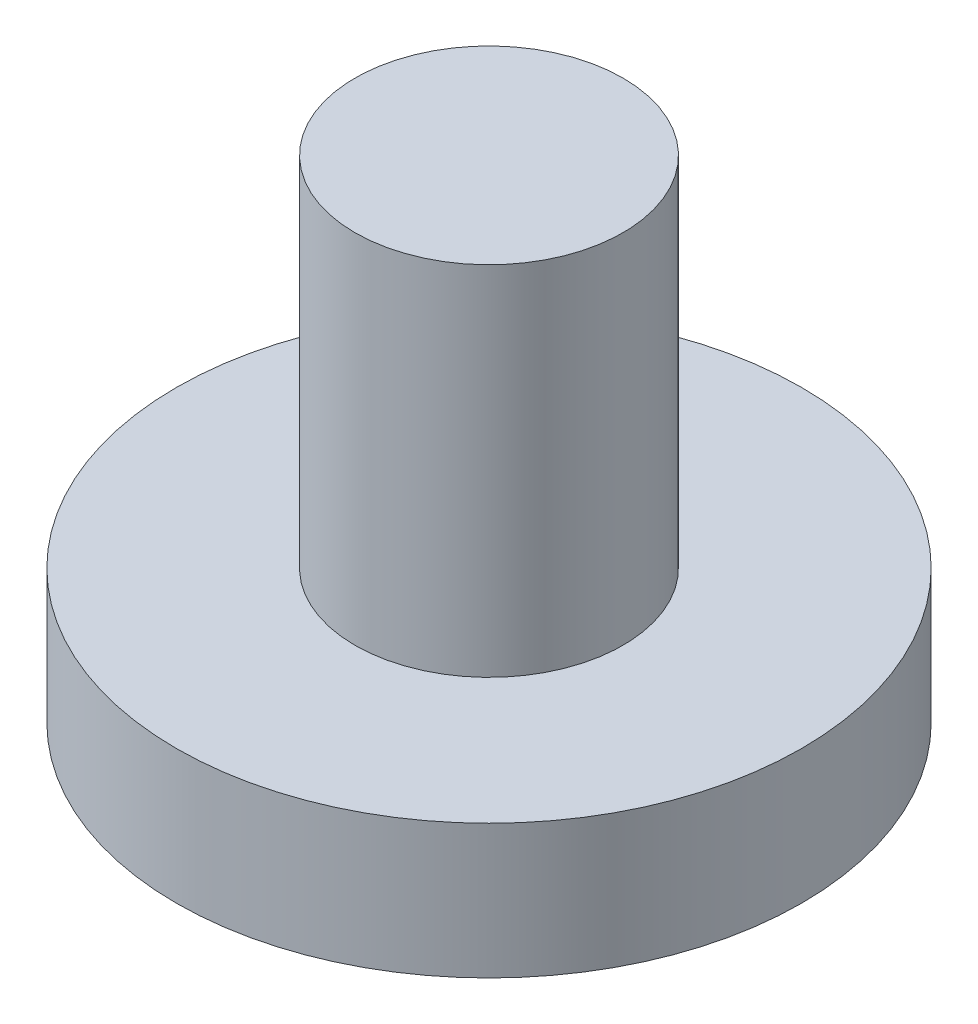
ISO-10303-21;
HEADER;
FILE_DESCRIPTION(('STEP AP214'),'2;1');
FILE_NAME('part.step','',(''),(''),'','','');
FILE_SCHEMA(('AUTOMOTIVE_DESIGN { 1 0 10303 214 1 1 1 1 }'));
ENDSEC;
DATA;
#1=APPLICATION_CONTEXT('core data for automotive mechanical design processes');
#2=APPLICATION_PROTOCOL_DEFINITION('international standard','automotive_design',2000,#1);
#3=PRODUCT_CONTEXT('',#1,'mechanical');
#4=PRODUCT('Part','Part','',(#3));
#5=PRODUCT_RELATED_PRODUCT_CATEGORY('part','',(#4));
#6=PRODUCT_DEFINITION_FORMATION('','',#4);
#7=PRODUCT_DEFINITION_CONTEXT('part definition',#1,'design');
#8=PRODUCT_DEFINITION('design','',#6,#7);
#9=PRODUCT_DEFINITION_SHAPE('','',#8);
#10=(LENGTH_UNIT() NAMED_UNIT(*) SI_UNIT(.MILLI.,.METRE.));
#11=(NAMED_UNIT(*) PLANE_ANGLE_UNIT() SI_UNIT($,.RADIAN.));
#12=(NAMED_UNIT(*) SI_UNIT($,.STERADIAN.) SOLID_ANGLE_UNIT());
#13=UNCERTAINTY_MEASURE_WITH_UNIT(LENGTH_MEASURE(1.E-05),#10,'distance_accuracy_value','');
#14=(GEOMETRIC_REPRESENTATION_CONTEXT(3) GLOBAL_UNCERTAINTY_ASSIGNED_CONTEXT((#13)) GLOBAL_UNIT_ASSIGNED_CONTEXT((#10,
#11,#12)) REPRESENTATION_CONTEXT('',''));
#15=CARTESIAN_POINT('',(0.,0.,0.));
#16=DIRECTION('',(0.,0.,1.));
#17=DIRECTION('',(1.,0.,0.));
#18=AXIS2_PLACEMENT_3D('',#15,#16,#17);
#19=CARTESIAN_POINT('',(0.,5.5,0.));
#20=DIRECTION('',(0.,1.,0.));
#21=DIRECTION('',(0.,0.,1.));
#22=AXIS2_PLACEMENT_3D('',#19,#20,#21);
#23=PLANE('',#22);
#24=CARTESIAN_POINT('',(0.,5.5,0.));
#25=DIRECTION('',(0.,-1.,0.));
#26=DIRECTION('',(0.,0.,-1.));
#27=AXIS2_PLACEMENT_3D('',#24,#25,#26);
#28=CIRCLE('',#27,1.5);
#29=CARTESIAN_POINT('',(0.,5.5,-1.5));
#30=VERTEX_POINT('',#29);
#31=EDGE_CURVE('E19',#30,#30,#28,.T.);
#32=ORIENTED_EDGE('',*,*,#31,.F.);
#33=EDGE_LOOP('',(#32));
#34=FACE_BOUND('',#33,.T.);
#35=ADVANCED_FACE('F16',(#34),#23,.T.);
#36=CARTESIAN_POINT('',(0.,5.5,0.));
#37=DIRECTION('',(0.,-1.,0.));
#38=DIRECTION('',(0.,0.,-1.));
#39=AXIS2_PLACEMENT_3D('',#36,#37,#38);
#40=CYLINDRICAL_SURFACE('',#39,1.5);
#41=CARTESIAN_POINT('',(0.,1.5,0.));
#42=DIRECTION('',(0.,-1.,0.));
#43=DIRECTION('',(0.,0.,-1.));
#44=AXIS2_PLACEMENT_3D('',#41,#42,#43);
#45=CIRCLE('',#44,1.5);
#46=CARTESIAN_POINT('',(0.,1.5,-1.5));
#47=VERTEX_POINT('',#46);
#48=EDGE_CURVE('E78',#47,#47,#45,.T.);
#49=ORIENTED_EDGE('',*,*,#48,.F.);
#50=EDGE_LOOP('',(#49));
#51=FACE_BOUND('',#50,.T.);
#52=ORIENTED_EDGE('',*,*,#31,.T.);
#53=EDGE_LOOP('',(#52));
#54=FACE_BOUND('',#53,.T.);
#55=ADVANCED_FACE('F102',(#51,#54),#40,.T.);
#56=CARTESIAN_POINT('',(0.,0.8,0.));
#57=DIRECTION('',(0.,-1.,0.));
#58=DIRECTION('',(0.,0.,-1.));
#59=AXIS2_PLACEMENT_3D('',#56,#57,#58);
#60=PLANE('',#59);
#61=DIRECTION('',(-0.5,0.,0.866025403784439));
#62=VECTOR('',#61,1.);
#63=CARTESIAN_POINT('',(-1.15470053837925,0.8,0.));
#64=LINE('',#63,#62);
#65=CARTESIAN_POINT('',(-1.15470053837925,0.8,0.));
#66=VERTEX_POINT('',#65);
#67=CARTESIAN_POINT('',(-0.577350269189625,0.8,-1.));
#68=VERTEX_POINT('',#67);
#69=EDGE_CURVE('E232',#66,#68,#64,.F.);
#70=ORIENTED_EDGE('',*,*,#69,.T.);
#71=DIRECTION('',(-1.,0.,0.));
#72=VECTOR('',#71,1.);
#73=CARTESIAN_POINT('',(-0.577350269189625,0.8,-1.));
#74=LINE('',#73,#72);
#75=CARTESIAN_POINT('',(0.577350269189626,0.8,-1.));
#76=VERTEX_POINT('',#75);
#77=EDGE_CURVE('E238',#68,#76,#74,.F.);
#78=ORIENTED_EDGE('',*,*,#77,.T.);
#79=DIRECTION('',(-0.5,0.,-0.866025403784439));
#80=VECTOR('',#79,1.);
#81=CARTESIAN_POINT('',(0.577350269189626,0.8,-1.));
#82=LINE('',#81,#80);
#83=CARTESIAN_POINT('',(1.15470053837925,0.8,0.));
#84=VERTEX_POINT('',#83);
#85=EDGE_CURVE('E246',#76,#84,#82,.F.);
#86=ORIENTED_EDGE('',*,*,#85,.T.);
#87=DIRECTION('',(0.5,0.,-0.866025403784439));
#88=VECTOR('',#87,1.);
#89=CARTESIAN_POINT('',(1.15470053837925,0.8,0.));
#90=LINE('',#89,#88);
#91=CARTESIAN_POINT('',(0.577350269189625,0.8,1.));
#92=VERTEX_POINT('',#91);
#93=EDGE_CURVE('E72',#84,#92,#90,.F.);
#94=ORIENTED_EDGE('',*,*,#93,.T.);
#95=DIRECTION('',(1.,0.,0.));
#96=VECTOR('',#95,1.);
#97=CARTESIAN_POINT('',(0.577350269189625,0.8,1.));
#98=LINE('',#97,#96);
#99=CARTESIAN_POINT('',(-0.577350269189626,0.8,1.));
#100=VERTEX_POINT('',#99);
#101=EDGE_CURVE('E70',#92,#100,#98,.F.);
#102=ORIENTED_EDGE('',*,*,#101,.T.);
#103=DIRECTION('',(0.5,0.,0.866025403784439));
#104=VECTOR('',#103,1.);
#105=CARTESIAN_POINT('',(-0.577350269189626,0.8,1.));
#106=LINE('',#105,#104);
#107=EDGE_CURVE('E67',#100,#66,#106,.F.);
#108=ORIENTED_EDGE('',*,*,#107,.T.);
#109=EDGE_LOOP('',(#70,#78,#86,#94,#102,#108));
#110=FACE_BOUND('',#109,.T.);
#111=ADVANCED_FACE('F71',(#110),#60,.T.);
#112=CARTESIAN_POINT('',(0.,1.5,0.));
#113=DIRECTION('',(0.,1.,0.));
#114=DIRECTION('',(0.,0.,1.));
#115=AXIS2_PLACEMENT_3D('',#112,#113,#114);
#116=PLANE('',#115);
#117=ORIENTED_EDGE('',*,*,#48,.T.);
#118=EDGE_LOOP('',(#117));
#119=FACE_BOUND('',#118,.T.);
#120=CARTESIAN_POINT('',(0.,1.5,0.));
#121=DIRECTION('',(0.,-1.,0.));
#122=DIRECTION('',(0.,0.,-1.));
#123=AXIS2_PLACEMENT_3D('',#120,#121,#122);
#124=CIRCLE('',#123,3.5);
#125=CARTESIAN_POINT('',(0.,1.5,-3.5));
#126=VERTEX_POINT('',#125);
#127=EDGE_CURVE('E93',#126,#126,#124,.T.);
#128=ORIENTED_EDGE('',*,*,#127,.F.);
#129=EDGE_LOOP('',(#128));
#130=FACE_BOUND('',#129,.T.);
#131=ADVANCED_FACE('F142',(#119,#130),#116,.T.);
#132=CARTESIAN_POINT('',(0.577350269189625,0.8,1.));
#133=DIRECTION('',(0.,0.,1.));
#134=DIRECTION('',(1.,0.,0.));
#135=AXIS2_PLACEMENT_3D('',#132,#133,#134);
#136=PLANE('',#135);
#137=DIRECTION('',(0.,1.,0.));
#138=VECTOR('',#137,1.);
#139=CARTESIAN_POINT('',(-0.577350269189626,0.8,1.));
#140=LINE('',#139,#138);
#141=CARTESIAN_POINT('',(-0.577350269189626,0.,1.));
#142=VERTEX_POINT('',#141);
#143=EDGE_CURVE('E77',#142,#100,#140,.T.);
#144=ORIENTED_EDGE('',*,*,#143,.T.);
#145=ORIENTED_EDGE('',*,*,#101,.F.);
#146=DIRECTION('',(0.,1.,0.));
#147=VECTOR('',#146,1.);
#148=CARTESIAN_POINT('',(0.577350269189625,0.8,1.));
#149=LINE('',#148,#147);
#150=CARTESIAN_POINT('',(0.577350269189625,0.,1.));
#151=VERTEX_POINT('',#150);
#152=EDGE_CURVE('E95',#92,#151,#149,.F.);
#153=ORIENTED_EDGE('',*,*,#152,.T.);
#154=DIRECTION('',(1.,0.,0.));
#155=VECTOR('',#154,1.);
#156=CARTESIAN_POINT('',(0.,0.,1.));
#157=LINE('',#156,#155);
#158=EDGE_CURVE('E89',#151,#142,#157,.F.);
#159=ORIENTED_EDGE('',*,*,#158,.T.);
#160=EDGE_LOOP('',(#144,#145,#153,#159));
#161=FACE_BOUND('',#160,.T.);
#162=ADVANCED_FACE('F88',(#161),#136,.F.);
#163=CARTESIAN_POINT('',(-0.577350269189626,0.8,1.));
#164=DIRECTION('',(-0.866025403784439,0.,0.5));
#165=DIRECTION('',(0.5,0.,0.866025403784439));
#166=AXIS2_PLACEMENT_3D('',#163,#164,#165);
#167=PLANE('',#166);
#168=DIRECTION('',(0.,1.,0.));
#169=VECTOR('',#168,1.);
#170=CARTESIAN_POINT('',(-1.15470053837925,0.8,0.));
#171=LINE('',#170,#169);
#172=CARTESIAN_POINT('',(-1.15470053837925,0.,0.));
#173=VERTEX_POINT('',#172);
#174=EDGE_CURVE('E85',#173,#66,#171,.T.);
#175=ORIENTED_EDGE('',*,*,#174,.T.);
#176=ORIENTED_EDGE('',*,*,#107,.F.);
#177=ORIENTED_EDGE('',*,*,#143,.F.);
#178=DIRECTION('',(-0.5,0.,-0.866025403784439));
#179=VECTOR('',#178,1.);
#180=CARTESIAN_POINT('',(-0.577350269189626,0.,1.));
#181=LINE('',#180,#179);
#182=EDGE_CURVE('E252',#142,#173,#181,.T.);
#183=ORIENTED_EDGE('',*,*,#182,.T.);
#184=EDGE_LOOP('',(#175,#176,#177,#183));
#185=FACE_BOUND('',#184,.T.);
#186=ADVANCED_FACE('F82',(#185),#167,.F.);
#187=CARTESIAN_POINT('',(-1.15470053837925,0.8,0.));
#188=DIRECTION('',(-0.866025403784439,0.,-0.5));
#189=DIRECTION('',(-0.5,0.,0.866025403784439));
#190=AXIS2_PLACEMENT_3D('',#187,#188,#189);
#191=PLANE('',#190);
#192=DIRECTION('',(0.,1.,0.));
#193=VECTOR('',#192,1.);
#194=CARTESIAN_POINT('',(-0.577350269189625,0.8,-1.));
#195=LINE('',#194,#193);
#196=CARTESIAN_POINT('',(-0.577350269189625,0.,-1.));
#197=VERTEX_POINT('',#196);
#198=EDGE_CURVE('E231',#197,#68,#195,.T.);
#199=ORIENTED_EDGE('',*,*,#198,.T.);
#200=ORIENTED_EDGE('',*,*,#69,.F.);
#201=ORIENTED_EDGE('',*,*,#174,.F.);
#202=DIRECTION('',(0.5,0.,-0.866025403784438));
#203=VECTOR('',#202,1.);
#204=CARTESIAN_POINT('',(-1.15470053837925,0.,0.));
#205=LINE('',#204,#203);
#206=EDGE_CURVE('E234',#173,#197,#205,.T.);
#207=ORIENTED_EDGE('',*,*,#206,.T.);
#208=EDGE_LOOP('',(#199,#200,#201,#207));
#209=FACE_BOUND('',#208,.T.);
#210=ADVANCED_FACE('F133',(#209),#191,.F.);
#211=CARTESIAN_POINT('',(-0.577350269189625,0.8,-1.));
#212=DIRECTION('',(0.,0.,-1.));
#213=DIRECTION('',(-1.,0.,0.));
#214=AXIS2_PLACEMENT_3D('',#211,#212,#213);
#215=PLANE('',#214);
#216=DIRECTION('',(0.,1.,0.));
#217=VECTOR('',#216,1.);
#218=CARTESIAN_POINT('',(0.577350269189626,0.8,-1.));
#219=LINE('',#218,#217);
#220=CARTESIAN_POINT('',(0.577350269189626,0.,-1.));
#221=VERTEX_POINT('',#220);
#222=EDGE_CURVE('E240',#221,#76,#219,.T.);
#223=ORIENTED_EDGE('',*,*,#222,.T.);
#224=ORIENTED_EDGE('',*,*,#77,.F.);
#225=ORIENTED_EDGE('',*,*,#198,.F.);
#226=DIRECTION('',(1.,0.,0.));
#227=VECTOR('',#226,1.);
#228=CARTESIAN_POINT('',(0.,0.,-1.));
#229=LINE('',#228,#227);
#230=EDGE_CURVE('E255',#197,#221,#229,.T.);
#231=ORIENTED_EDGE('',*,*,#230,.T.);
#232=EDGE_LOOP('',(#223,#224,#225,#231));
#233=FACE_BOUND('',#232,.T.);
#234=ADVANCED_FACE('F129',(#233),#215,.F.);
#235=CARTESIAN_POINT('',(0.577350269189626,0.8,-1.));
#236=DIRECTION('',(0.866025403784439,0.,-0.5));
#237=DIRECTION('',(-0.5,0.,-0.866025403784439));
#238=AXIS2_PLACEMENT_3D('',#235,#236,#237);
#239=PLANE('',#238);
#240=DIRECTION('',(0.,1.,0.));
#241=VECTOR('',#240,1.);
#242=CARTESIAN_POINT('',(1.15470053837925,0.8,0.));
#243=LINE('',#242,#241);
#244=CARTESIAN_POINT('',(1.15470053837925,0.,0.));
#245=VERTEX_POINT('',#244);
#246=EDGE_CURVE('E34',#245,#84,#243,.T.);
#247=ORIENTED_EDGE('',*,*,#246,.T.);
#248=ORIENTED_EDGE('',*,*,#85,.F.);
#249=ORIENTED_EDGE('',*,*,#222,.F.);
#250=DIRECTION('',(0.5,0.,0.866025403784439));
#251=VECTOR('',#250,1.);
#252=CARTESIAN_POINT('',(0.577350269189626,0.,-1.));
#253=LINE('',#252,#251);
#254=EDGE_CURVE('E257',#221,#245,#253,.T.);
#255=ORIENTED_EDGE('',*,*,#254,.T.);
#256=EDGE_LOOP('',(#247,#248,#249,#255));
#257=FACE_BOUND('',#256,.T.);
#258=ADVANCED_FACE('F126',(#257),#239,.F.);
#259=CARTESIAN_POINT('',(1.15470053837925,0.8,0.));
#260=DIRECTION('',(0.866025403784439,0.,0.5));
#261=DIRECTION('',(0.5,0.,-0.866025403784439));
#262=AXIS2_PLACEMENT_3D('',#259,#260,#261);
#263=PLANE('',#262);
#264=ORIENTED_EDGE('',*,*,#152,.F.);
#265=ORIENTED_EDGE('',*,*,#93,.F.);
#266=ORIENTED_EDGE('',*,*,#246,.F.);
#267=DIRECTION('',(-0.5,0.,0.866025403784439));
#268=VECTOR('',#267,1.);
#269=CARTESIAN_POINT('',(1.15470053837925,0.,0.));
#270=LINE('',#269,#268);
#271=EDGE_CURVE('E25',#245,#151,#270,.T.);
#272=ORIENTED_EDGE('',*,*,#271,.T.);
#273=EDGE_LOOP('',(#264,#265,#266,#272));
#274=FACE_BOUND('',#273,.T.);
#275=ADVANCED_FACE('F118',(#274),#263,.F.);
#276=CARTESIAN_POINT('',(0.,1.5,0.));
#277=DIRECTION('',(0.,-1.,0.));
#278=DIRECTION('',(0.,0.,-1.));
#279=AXIS2_PLACEMENT_3D('',#276,#277,#278);
#280=CYLINDRICAL_SURFACE('',#279,3.5);
#281=ORIENTED_EDGE('',*,*,#127,.T.);
#282=EDGE_LOOP('',(#281));
#283=FACE_BOUND('',#282,.T.);
#284=CARTESIAN_POINT('',(0.,0.,0.));
#285=DIRECTION('',(0.,-1.,0.));
#286=DIRECTION('',(0.,0.,-1.));
#287=AXIS2_PLACEMENT_3D('',#284,#285,#286);
#288=CIRCLE('',#287,3.5);
#289=CARTESIAN_POINT('',(0.,0.,-3.5));
#290=VERTEX_POINT('',#289);
#291=EDGE_CURVE('E11',#290,#290,#288,.F.);
#292=ORIENTED_EDGE('',*,*,#291,.T.);
#293=EDGE_LOOP('',(#292));
#294=FACE_BOUND('',#293,.T.);
#295=ADVANCED_FACE('F112',(#283,#294),#280,.T.);
#296=CARTESIAN_POINT('',(0.,0.,0.));
#297=DIRECTION('',(0.,1.,0.));
#298=DIRECTION('',(0.,0.,1.));
#299=AXIS2_PLACEMENT_3D('',#296,#297,#298);
#300=PLANE('',#299);
#301=ORIENTED_EDGE('',*,*,#291,.F.);
#302=EDGE_LOOP('',(#301));
#303=FACE_BOUND('',#302,.T.);
#304=ORIENTED_EDGE('',*,*,#254,.F.);
#305=ORIENTED_EDGE('',*,*,#230,.F.);
#306=ORIENTED_EDGE('',*,*,#206,.F.);
#307=ORIENTED_EDGE('',*,*,#182,.F.);
#308=ORIENTED_EDGE('',*,*,#158,.F.);
#309=ORIENTED_EDGE('',*,*,#271,.F.);
#310=EDGE_LOOP('',(#304,#305,#306,#307,#308,#309));
#311=FACE_BOUND('',#310,.T.);
#312=ADVANCED_FACE('F110',(#303,#311),#300,.F.);
#313=CLOSED_SHELL('',(#35,#55,#111,#131,#162,#186,#210,#234,#258,#275,#295,#312));
#314=MANIFOLD_SOLID_BREP('B1',#313);
#315=ADVANCED_BREP_SHAPE_REPRESENTATION('',(#18,#314),#14);
#316=SHAPE_DEFINITION_REPRESENTATION(#9,#315);
ENDSEC;
END-ISO-10303-21;
